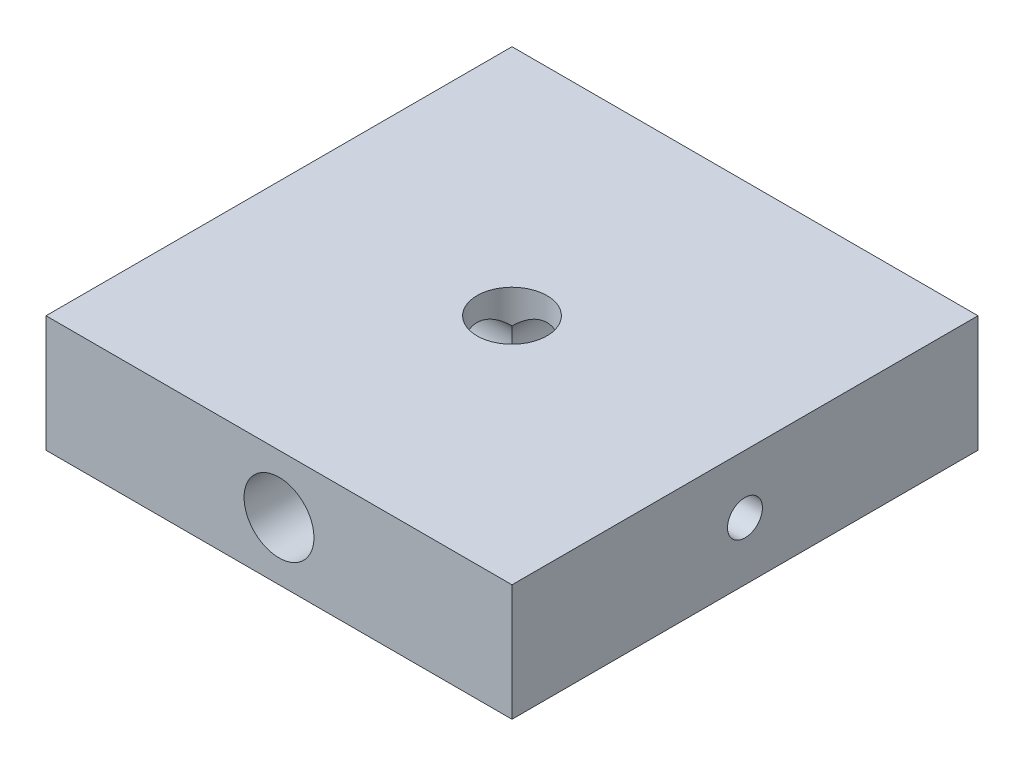
ISO-10303-21;
HEADER;
FILE_DESCRIPTION(('STEP AP214'),'2;1');
FILE_NAME('part.step','',(''),(''),'','','');
FILE_SCHEMA(('AUTOMOTIVE_DESIGN { 1 0 10303 214 1 1 1 1 }'));
ENDSEC;
DATA;
#1=APPLICATION_CONTEXT('core data for automotive mechanical design processes');
#2=APPLICATION_PROTOCOL_DEFINITION('international standard','automotive_design',2000,#1);
#3=PRODUCT_CONTEXT('',#1,'mechanical');
#4=PRODUCT('Part','Part','',(#3));
#5=PRODUCT_RELATED_PRODUCT_CATEGORY('part','',(#4));
#6=PRODUCT_DEFINITION_FORMATION('','',#4);
#7=PRODUCT_DEFINITION_CONTEXT('part definition',#1,'design');
#8=PRODUCT_DEFINITION('design','',#6,#7);
#9=PRODUCT_DEFINITION_SHAPE('','',#8);
#10=(LENGTH_UNIT() NAMED_UNIT(*) SI_UNIT(.MILLI.,.METRE.));
#11=(NAMED_UNIT(*) PLANE_ANGLE_UNIT() SI_UNIT($,.RADIAN.));
#12=(NAMED_UNIT(*) SI_UNIT($,.STERADIAN.) SOLID_ANGLE_UNIT());
#13=UNCERTAINTY_MEASURE_WITH_UNIT(LENGTH_MEASURE(1.E-05),#10,'distance_accuracy_value','');
#14=(GEOMETRIC_REPRESENTATION_CONTEXT(3) GLOBAL_UNCERTAINTY_ASSIGNED_CONTEXT((#13)) GLOBAL_UNIT_ASSIGNED_CONTEXT((#10,
#11,#12)) REPRESENTATION_CONTEXT('',''));
#15=CARTESIAN_POINT('',(0.,0.,0.));
#16=DIRECTION('',(0.,0.,1.));
#17=DIRECTION('',(1.,0.,0.));
#18=AXIS2_PLACEMENT_3D('',#15,#16,#17);
#19=CARTESIAN_POINT('',(0.,0.,-20.));
#20=DIRECTION('',(0.,0.,1.));
#21=DIRECTION('',(1.,0.,0.));
#22=AXIS2_PLACEMENT_3D('',#19,#20,#21);
#23=CYLINDRICAL_SURFACE('',#22,1.5);
#24=CARTESIAN_POINT('',(1.29903810567666,0.750000000000001,-10.7497495870781));
#25=CARTESIAN_POINT('',(1.27511464432901,0.791416541643271,-10.7911897819324));
#26=CARTESIAN_POINT('',(1.24892947696519,0.83221208637339,-10.8320057918435));
#27=CARTESIAN_POINT('',(1.19174112497098,0.912244017879416,-10.9120741352069));
#28=CARTESIAN_POINT('',(1.16072240849882,0.951474847611314,-10.9513208965639));
#29=CARTESIAN_POINT('',(1.09330759971749,1.02825974345045,-11.0281350449026));
#30=CARTESIAN_POINT('',(1.05684908459245,1.06578668998977,-11.0656752771585));
#31=CARTESIAN_POINT('',(0.978721037612754,1.13794974653868,-11.1378629272671));
#32=CARTESIAN_POINT('',(0.937059378139727,1.17259009469766,-11.1725145861965));
#33=CARTESIAN_POINT('',(0.840350526851361,1.24420790184499,-11.2441556349555));
#34=CARTESIAN_POINT('',(0.784244034258449,1.28048208259828,-11.2804414911451));
#35=CARTESIAN_POINT('',(0.664909112667032,1.34629452319567,-11.3462761006879));
#36=CARTESIAN_POINT('',(0.601713891644421,1.37586237954829,-11.3758544556352));
#37=CARTESIAN_POINT('',(0.47871407541481,1.42284925435497,-11.4228601503171));
#38=CARTESIAN_POINT('',(0.419795560130148,1.44141945673511,-11.4414387660361));
#39=CARTESIAN_POINT('',(0.298341366459725,1.47135917461159,-11.4713950346965));
#40=CARTESIAN_POINT('',(0.235805423714575,1.48272816312026,-11.4827721606299));
#41=CARTESIAN_POINT('',(0.1085852142336,1.49743880028038,-11.4974989852144));
#42=CARTESIAN_POINT('',(0.0438933506576993,1.50074813737528,-11.5008163718287));
#43=CARTESIAN_POINT('',(-0.0852563863436678,1.4989666989663,-11.4990510465123));
#44=CARTESIAN_POINT('',(-0.149714271058643,1.49387633429685,-11.4939687454154));
#45=CARTESIAN_POINT('',(-0.271814521270318,1.47636489272062,-11.4764730048235));
#46=CARTESIAN_POINT('',(-0.329616478597476,1.4644877977301,-11.4646035370458));
#47=CARTESIAN_POINT('',(-0.441894507301003,1.43461047531033,-11.4347417310686));
#48=CARTESIAN_POINT('',(-0.496371626534824,1.41661218891484,-11.416751333819));
#49=CARTESIAN_POINT('',(-0.619189034508718,1.36832873390818,-11.3684868803142));
#50=CARTESIAN_POINT('',(-0.685879203893564,1.33594663542933,-11.3361160719738));
#51=CARTESIAN_POINT('',(-0.811180359079277,1.26382507841526,-11.2640185161302));
#52=CARTESIAN_POINT('',(-0.869746288705667,1.2240472457019,-11.2242534017161));
#53=CARTESIAN_POINT('',(-0.964550081847773,1.14990785831052,-11.1501381988681));
#54=CARTESIAN_POINT('',(-1.00268253872559,1.11673347628072,-11.1169747817678));
#55=CARTESIAN_POINT('',(-1.07437319503784,1.04794651858372,-11.0482116227798));
#56=CARTESIAN_POINT('',(-1.1079262853143,1.01233128513655,-11.0126092251669));
#57=CARTESIAN_POINT('',(-1.17014312203526,0.939693336919766,-10.9399994278676));
#58=CARTESIAN_POINT('',(-1.19886647247207,0.902695943563578,-10.9030173139888));
#59=CARTESIAN_POINT('',(-1.25206439845904,0.82731501508056,-10.8276710635884));
#60=CARTESIAN_POINT('',(-1.27654954972619,0.788935227609418,-10.7893106641929));
#61=CARTESIAN_POINT('',(-1.29903810567665,0.750000000000001,-10.7503976721348));
#62=B_SPLINE_CURVE_WITH_KNOTS('',3,(#24,#25,#26,#27,#28,#29,#30,#31,#32,#33,#34,#35,#36,#37,#38,
#39,#40,#41,#42,#43,#44,#45,#46,#47,#48,#49,#50,#51,#52,#53,#54,#55,#56,#57,#58,#59,#60,#61),
.UNSPECIFIED.,.F.,.F.,(4,2,2,2,2,2,2,2,2,2,2,2,2,2,2,2,2,2,4),(0.,0.189866612214772,
0.380356414187857,0.573229503423911,0.765814231950156,0.993094810092584,1.21935193710475,
1.41206892665803,1.60480001768761,1.7983025148502,1.99179554797114,2.17160246063505,
2.35135240948963,2.59272605399861,2.83538895290785,3.01647128126453,3.1977540182231,
3.37660249600969,3.55499804380087),.UNSPECIFIED.);
#63=CARTESIAN_POINT('',(1.29903810567666,0.750000000000001,-10.7497495870781));
#64=VERTEX_POINT('',#63);
#65=CARTESIAN_POINT('',(-1.05988828872471,1.06143149351439,-11.0616919975508));
#66=VERTEX_POINT('',#65);
#67=EDGE_CURVE('E117',#64,#66,#62,.T.);
#68=ORIENTED_EDGE('',*,*,#67,.T.);
#69=CARTESIAN_POINT('',(-0.749999999999994,1.29903810567666,-10.7524438843595));
#70=CARTESIAN_POINT('',(-0.791474966642295,1.27508053973886,-10.7938080862093));
#71=CARTESIAN_POINT('',(-0.832318672463505,1.2488604404016,-10.8345559351006));
#72=CARTESIAN_POINT('',(-0.91243116283438,1.19160019255444,-10.9144978441075));
#73=CARTESIAN_POINT('',(-0.951694323621616,1.16054446945038,-10.9536863510264));
#74=CARTESIAN_POINT('',(-1.02853233850996,1.09305325311193,-11.0303872731834));
#75=CARTESIAN_POINT('',(-1.06607991531406,1.05655529868409,-11.0678725756803));
#76=CARTESIAN_POINT('',(-1.13827321461837,0.978346979708515,-11.1399505828077));
#77=CARTESIAN_POINT('',(-1.17292320244971,0.936644510232895,-11.1745475390345));
#78=CARTESIAN_POINT('',(-1.24452438327382,0.83988157681135,-11.2460397774227));
#79=CARTESIAN_POINT('',(-1.28077366592311,0.783766786138214,-11.2822343387924));
#80=CARTESIAN_POINT('',(-1.34653174904933,0.664427412338442,-11.3478885049052));
#81=CARTESIAN_POINT('',(-1.37607018618365,0.601236005354433,-11.3773777225186));
#82=CARTESIAN_POINT('',(-1.42300817611768,0.478241322560289,-11.424227460856));
#83=CARTESIAN_POINT('',(-1.44155728097269,0.419320779946205,-11.4427371040069));
#84=CARTESIAN_POINT('',(-1.47145372715688,0.297872964479321,-11.472555916));
#85=CARTESIAN_POINT('',(-1.48280052765151,0.235345421154571,-11.4838645441046));
#86=CARTESIAN_POINT('',(-1.49746917484998,0.108155002704537,-11.4984572538936));
#87=CARTESIAN_POINT('',(-1.50075889016487,0.0434846169310038,-11.5017092064161));
#88=CARTESIAN_POINT('',(-1.49894530814072,-0.0856120753272672,-11.4998200299267));
#89=CARTESIAN_POINT('',(-1.49384240136821,-0.150038393030327,-11.4946792914847));
#90=CARTESIAN_POINT('',(-1.47631292085969,-0.272095006037706,-11.4770761302946));
#91=CARTESIAN_POINT('',(-1.46442693337265,-0.329884516347488,-11.4651543415955));
#92=CARTESIAN_POINT('',(-1.43453658252856,-0.442132667133472,-11.4351911552631));
#93=CARTESIAN_POINT('',(-1.41653415156945,-0.496592353213105,-11.4171516904206));
#94=CARTESIAN_POINT('',(-1.36823250532858,-0.619403864143875,-11.3687608133281));
#95=CARTESIAN_POINT('',(-1.33583349634971,-0.686100385200389,-11.3363087691988));
#96=CARTESIAN_POINT('',(-1.2636823292925,-0.811403461770784,-11.2640448427042));
#97=CARTESIAN_POINT('',(-1.22389180993195,-0.869964890677812,-11.2241945648321));
#98=CARTESIAN_POINT('',(-1.14974132117162,-0.964748165372767,-11.1499304277903));
#99=CARTESIAN_POINT('',(-1.11656712359448,-1.00286711468167,-11.1167047018603));
#100=CARTESIAN_POINT('',(-1.04778743187299,-1.07452773454887,-11.0478131534385));
#101=CARTESIAN_POINT('',(-1.01217928949228,-1.10806429639944,-11.0121446730413));
#102=CARTESIAN_POINT('',(-0.939564660497332,-1.17024558279176,-10.9393976894386));
#103=CARTESIAN_POINT('',(-0.902583383353352,-1.19894996817376,-10.9023445634704));
#104=CARTESIAN_POINT('',(-0.827247821428806,-1.25210777351173,-10.8268458900234));
#105=CARTESIAN_POINT('',(-0.78889724818272,-1.27657176760186,-10.78840410367));
#106=CARTESIAN_POINT('',(-0.749999999999994,-1.29903810567666,-10.7494022184032));
#107=B_SPLINE_CURVE_WITH_KNOTS('',3,(#69,#70,#71,#72,#73,#74,#75,#76,#77,#78,#79,#80,#81,#82,
#83,#84,#85,#86,#87,#88,#89,#90,#91,#92,#93,#94,#95,#96,#97,#98,#99,#100,#101,#102,#103,#104,
#105,#106),.UNSPECIFIED.,.F.,.F.,(4,2,2,2,2,2,2,2,2,2,2,2,2,2,2,2,2,2,4),(0.,0.189871056870257,
0.380366807549209,0.573246508240148,0.765837094639792,0.992970045215826,1.21907953289419,
1.41172434354104,1.60438361853747,1.7978099702851,1.99122732082684,2.17103508217803,
2.3507860887256,2.59229251206705,2.83508924639655,3.01624836557675,3.19760783154663,
3.37653108167756,3.55500152849266),.UNSPECIFIED.);
#108=CARTESIAN_POINT('',(-0.749999999999994,-1.29903810567666,-10.7494022184032));
#109=VERTEX_POINT('',#108);
#110=EDGE_CURVE('E60',#66,#109,#107,.T.);
#111=ORIENTED_EDGE('',*,*,#110,.T.);
#112=DIRECTION('',(0.,0.,1.));
#113=VECTOR('',#112,1.);
#114=CARTESIAN_POINT('',(-0.749999999999994,-1.29903810567666,-20.));
#115=LINE('',#114,#113);
#116=CARTESIAN_POINT('',(-0.749999999999994,-1.29903810567666,-9.25244799624026));
#117=VERTEX_POINT('',#116);
#118=EDGE_CURVE('E11',#117,#109,#115,.F.);
#119=ORIENTED_EDGE('',*,*,#118,.F.);
#120=CARTESIAN_POINT('',(-0.749999999999994,-1.29903810567666,-9.25244799624026));
#121=CARTESIAN_POINT('',(-0.791378459668392,-1.27513687474722,-9.21095836403504));
#122=CARTESIAN_POINT('',(-0.832142627772044,-1.24897446133104,-9.17009802132006));
#123=CARTESIAN_POINT('',(-0.912122093315857,-1.1918329190911,-9.0899474616306));
#124=CARTESIAN_POINT('',(-0.951331877145022,-1.16083828631388,-9.05066282895527));
#125=CARTESIAN_POINT('',(-1.02808219851903,-1.09347319315618,-8.97377508772186));
#126=CARTESIAN_POINT('',(-1.06559571935928,-1.05704033513621,-8.93619916116777));
#127=CARTESIAN_POINT('',(-1.13773909535913,-0.978964502377515,-8.86394027364597));
#128=CARTESIAN_POINT('',(-1.17237317100989,-0.937329385246596,-8.82925307844539));
#129=CARTESIAN_POINT('',(-1.24400181635121,-0.840655694162198,-8.75751526360986));
#130=CARTESIAN_POINT('',(-1.2802922226279,-0.78455457602408,-8.72117001205713));
#131=CARTESIAN_POINT('',(-1.34614007890024,-0.66522249147517,-8.65521802645996));
#132=CARTESIAN_POINT('',(-1.37572709934252,-0.602024753800345,-8.62558169804843));
#133=CARTESIAN_POINT('',(-1.42274579442569,-0.479021563702528,-8.57847462627444));
#134=CARTESIAN_POINT('',(-1.44132971922107,-0.420104375446722,-8.55985119911318));
#135=CARTESIAN_POINT('',(-1.47129758577594,-0.298646056045469,-8.52980562635012));
#136=CARTESIAN_POINT('',(-1.48268100952381,-0.236104664524258,-8.51838399885356));
#137=CARTESIAN_POINT('',(-1.49741897118375,-0.108865111697055,-8.50357004192335));
#138=CARTESIAN_POINT('',(-1.5007410804287,-0.0441592972698246,-8.50021014342859));
#139=CARTESIAN_POINT('',(-1.49898057370908,0.0850249037105786,-8.50189500758968));
#140=CARTESIAN_POINT('',(-1.49389838180932,0.149503301574241,-8.50693934618406));
#141=CARTESIAN_POINT('',(-1.47639869776037,0.271631920374528,-8.52436533505102));
#142=CARTESIAN_POINT('',(-1.4645273949448,0.329441974488925,-8.53620084389843));
#143=CARTESIAN_POINT('',(-1.43465856572751,0.441739433185851,-8.56599685762213));
#144=CARTESIAN_POINT('',(-1.41666298597381,0.496227887083055,-8.58395541624385));
#145=CARTESIAN_POINT('',(-1.36839138611873,0.619049116349264,-8.63213786944534));
#146=CARTESIAN_POINT('',(-1.33602030281199,0.685735136299976,-8.66445599530223));
#147=CARTESIAN_POINT('',(-1.26391806122445,0.811034987077905,-8.73644566656105));
#148=CARTESIAN_POINT('',(-1.22414852050326,0.869603807415817,-8.77615556037113));
#149=CARTESIAN_POINT('',(-1.15001633968922,0.964421021122321,-8.85017432830909));
#150=CARTESIAN_POINT('',(-1.11684176255778,1.00256236172513,-8.88329748670564));
#151=CARTESIAN_POINT('',(-1.04804994491361,1.07427270544125,-8.95197771445309));
#152=CARTESIAN_POINT('',(-1.01243004041933,1.10783659904371,-8.98753743815741));
#153=CARTESIAN_POINT('',(-0.939776844195164,1.17007661881957,-9.06005866446648));
#154=CARTESIAN_POINT('',(-0.902768946062069,1.19881231247391,-9.09699494015761));
#155=CARTESIAN_POINT('',(-0.827358544647731,1.25203629926282,-9.17224281691926));
#156=CARTESIAN_POINT('',(-0.788959812316156,1.27653516920402,-9.21055069634732));
#157=CARTESIAN_POINT('',(-0.749999999999993,1.29903810567666,-9.24940633028403));
#158=B_SPLINE_CURVE_WITH_KNOTS('',3,(#120,#121,#122,#123,#124,#125,#126,#127,#128,#129,#130,
#131,#132,#133,#134,#135,#136,#137,#138,#139,#140,#141,#142,#143,#144,#145,#146,#147,#148,#149,
#150,#151,#152,#153,#154,#155,#156,#157),.UNSPECIFIED.,.F.,.F.,(4,2,2,2,2,2,2,2,2,2,2,2,2,2,2,2,
2,2,4),(0.,0.189863784729165,0.38034977466764,0.573218607669685,0.765799571161449,
0.99317642325616,1.21952983021213,1.41229381576803,1.60507166739103,1.79862374019291,
1.99216604702884,2.17197252684019,2.35172190709203,2.59300940802914,2.83558547781771,
3.01661869717197,3.19785236667682,3.37665304487231,3.55500071145519),.UNSPECIFIED.);
#159=CARTESIAN_POINT('',(-1.06074080598181,1.06057953144734,-8.93930711003029));
#160=VERTEX_POINT('',#159);
#161=EDGE_CURVE('E110',#117,#160,#158,.T.);
#162=ORIENTED_EDGE('',*,*,#161,.T.);
#163=CARTESIAN_POINT('',(-1.29903810567665,0.750000000000001,-9.24974977375113));
#164=CARTESIAN_POINT('',(-1.27510264111983,0.791437104228356,-9.20833630422284));
#165=CARTESIAN_POINT('',(-1.24890518269438,0.832249595946499,-9.16754426326347));
#166=CARTESIAN_POINT('',(-1.19169153823548,0.912309870879977,-9.08752037690789));
#167=CARTESIAN_POINT('',(-1.16065980530911,0.951552073581364,-9.04829409697988));
#168=CARTESIAN_POINT('',(-1.09321812357867,1.02835565418707,-8.97151975402266));
#169=CARTESIAN_POINT('',(-1.05674573841735,1.06588985699928,-8.93399883096142));
#170=CARTESIAN_POINT('',(-0.978589462704573,1.13806355066492,-8.86184972089755));
#171=CARTESIAN_POINT('',(-0.936913452517174,1.17270728922177,-8.82721728911858));
#172=CARTESIAN_POINT('',(-0.840185586371386,1.24431924458941,-8.75562856505456));
#173=CARTESIAN_POINT('',(-0.78407618050792,1.28058466322624,-8.71937481622481));
#174=CARTESIAN_POINT('',(-0.664739705622199,1.34637797604103,-8.65360366271685));
#175=CARTESIAN_POINT('',(-0.601545833370044,1.37593548083517,-8.62405665250192));
#176=CARTESIAN_POINT('',(-0.478547829680332,1.42290515987274,-8.57710578766052));
#177=CARTESIAN_POINT('',(-0.419628599701637,1.44146794317561,-8.55855141585058));
#178=CARTESIAN_POINT('',(-0.298176644136465,1.47139244353506,-8.52864346300553));
#179=CARTESIAN_POINT('',(-0.235643652039413,1.48275362874109,-8.51729041380057));
#180=CARTESIAN_POINT('',(-0.108433911635989,1.4974494971014,-8.50261073023784));
#181=CARTESIAN_POINT('',(-0.0437495968460782,1.5007519320401,-8.49931634361739));
#182=CARTESIAN_POINT('',(0.0853814946782426,1.49895918491263,-8.5011252016541));
#183=CARTESIAN_POINT('',(0.149828282682497,1.49386440654341,-8.5062280426136));
#184=CARTESIAN_POINT('',(0.271913190647791,1.47634661626244,-8.52376153322059));
#185=CARTESIAN_POINT('',(0.329710770723505,1.46446639241853,-8.53564938460628));
#186=CARTESIAN_POINT('',(0.441978293429504,1.43458448439919,-8.56554680997593));
#187=CARTESIAN_POINT('',(0.496449283126491,1.41658473822127,-8.58355444587863));
#188=CARTESIAN_POINT('',(0.61926462044284,1.36829488123725,-8.63186330818693));
#189=CARTESIAN_POINT('',(0.685957027306486,1.33590683263892,-8.66426265045123));
#190=CARTESIAN_POINT('',(0.811258869835418,1.26377485107404,-8.73641864177184));
#191=CARTESIAN_POINT('',(0.869823224585033,1.22399254843743,-8.77621366777429));
#192=CARTESIAN_POINT('',(0.964619786315391,1.14984926021023,-8.85038115123195));
#193=CARTESIAN_POINT('',(1.00274747224772,1.11667495909897,-8.8835664222492));
#194=CARTESIAN_POINT('',(1.07442753386111,1.04789058514827,-8.95237460702129));
#195=CARTESIAN_POINT('',(1.10797480055526,1.01227785788365,-8.98800017725804));
#196=CARTESIAN_POINT('',(1.17017912296766,0.939648127213286,-9.06065807631026));
#197=CARTESIAN_POINT('',(1.19889580257018,0.902656405989629,-9.09766508728871));
#198=CARTESIAN_POINT('',(1.25207962734806,0.827291423483316,-9.17306477452055));
#199=CARTESIAN_POINT('',(1.27655734767113,0.78892189719696,-9.21145370523516));
#200=CARTESIAN_POINT('',(1.29903810567666,0.750000000000001,-9.25039785880778));
#201=B_SPLINE_CURVE_WITH_KNOTS('',3,(#163,#164,#165,#166,#167,#168,#169,#170,#171,#172,#173,
#174,#175,#176,#177,#178,#179,#180,#181,#182,#183,#184,#185,#186,#187,#188,#189,#190,#191,#192,
#193,#194,#195,#196,#197,#198,#199,#200),.UNSPECIFIED.,.F.,.F.,(4,2,2,2,2,2,2,2,2,2,2,2,2,2,2,2,
2,2,4),(0.,0.189868161758125,0.38036004350807,0.573235448371787,0.765822227303785,
0.993050837979506,1.21925599373608,1.41194759073009,1.60465341667596,1.79812912649467,
1.9915955352185,2.17140272097419,2.35115301637714,2.59257330664434,2.83528322251035,
3.0163923759386,3.1977019159475,3.37657650972762,3.55499821788487),.UNSPECIFIED.);
#202=CARTESIAN_POINT('',(1.29903810567666,0.750000000000001,-9.25039785880778));
#203=VERTEX_POINT('',#202);
#204=EDGE_CURVE('E157',#160,#203,#201,.T.);
#205=ORIENTED_EDGE('',*,*,#204,.T.);
#206=DIRECTION('',(0.,0.,1.));
#207=VECTOR('',#206,1.);
#208=CARTESIAN_POINT('',(1.29903810567666,0.750000000000001,-20.));
#209=LINE('',#208,#207);
#210=EDGE_CURVE('E176',#64,#203,#209,.T.);
#211=ORIENTED_EDGE('',*,*,#210,.F.);
#212=EDGE_LOOP('',(#68,#111,#119,#162,#205,#211));
#213=FACE_BOUND('',#212,.T.);
#214=CARTESIAN_POINT('',(0.,0.,0.));
#215=DIRECTION('',(0.,0.,1.));
#216=DIRECTION('',(1.,0.,0.));
#217=AXIS2_PLACEMENT_3D('',#214,#215,#216);
#218=CIRCLE('',#217,1.5);
#219=CARTESIAN_POINT('',(1.50000000000001,0.,0.));
#220=VERTEX_POINT('',#219);
#221=EDGE_CURVE('E224',#220,#220,#218,.T.);
#222=ORIENTED_EDGE('',*,*,#221,.T.);
#223=EDGE_LOOP('',(#222));
#224=FACE_BOUND('',#223,.T.);
#225=CARTESIAN_POINT('',(0.,0.,-20.));
#226=DIRECTION('',(0.,0.,1.));
#227=DIRECTION('',(1.,0.,0.));
#228=AXIS2_PLACEMENT_3D('',#225,#226,#227);
#229=CIRCLE('',#228,1.5);
#230=CARTESIAN_POINT('',(1.50000000000001,0.,-20.));
#231=VERTEX_POINT('',#230);
#232=EDGE_CURVE('E209',#231,#231,#229,.T.);
#233=ORIENTED_EDGE('',*,*,#232,.F.);
#234=EDGE_LOOP('',(#233));
#235=FACE_BOUND('',#234,.T.);
#236=ADVANCED_FACE('F44',(#213,#224,#235),#23,.F.);
#237=CARTESIAN_POINT('',(10.,-2.5,-20.));
#238=DIRECTION('',(1.,0.,0.));
#239=DIRECTION('',(0.,0.,-1.));
#240=AXIS2_PLACEMENT_3D('',#237,#238,#239);
#241=PLANE('',#240);
#242=CARTESIAN_POINT('',(10.,-0.00575293694534501,-9.99843688559378));
#243=DIRECTION('',(1.,0.,0.));
#244=DIRECTION('',(0.,0.,-1.));
#245=AXIS2_PLACEMENT_3D('',#242,#243,#244);
#246=CIRCLE('',#245,0.75);
#247=CARTESIAN_POINT('',(10.,-0.00575293694534501,-10.7484368855938));
#248=VERTEX_POINT('',#247);
#249=EDGE_CURVE('E250',#248,#248,#246,.T.);
#250=ORIENTED_EDGE('',*,*,#249,.F.);
#251=EDGE_LOOP('',(#250));
#252=FACE_BOUND('',#251,.T.);
#253=DIRECTION('',(0.,1.,0.));
#254=VECTOR('',#253,1.);
#255=CARTESIAN_POINT('',(10.,-2.5,0.));
#256=LINE('',#255,#254);
#257=CARTESIAN_POINT('',(10.,-2.5,0.));
#258=VERTEX_POINT('',#257);
#259=CARTESIAN_POINT('',(10.,2.5,0.));
#260=VERTEX_POINT('',#259);
#261=EDGE_CURVE('E205',#258,#260,#256,.T.);
#262=ORIENTED_EDGE('',*,*,#261,.F.);
#263=DIRECTION('',(0.,0.,1.));
#264=VECTOR('',#263,1.);
#265=CARTESIAN_POINT('',(10.,-2.5,-20.));
#266=LINE('',#265,#264);
#267=CARTESIAN_POINT('',(10.,-2.5,-20.));
#268=VERTEX_POINT('',#267);
#269=EDGE_CURVE('E179',#268,#258,#266,.T.);
#270=ORIENTED_EDGE('',*,*,#269,.F.);
#271=DIRECTION('',(0.,1.,0.));
#272=VECTOR('',#271,1.);
#273=CARTESIAN_POINT('',(10.,-2.5,-20.));
#274=LINE('',#273,#272);
#275=CARTESIAN_POINT('',(10.,2.5,-20.));
#276=VERTEX_POINT('',#275);
#277=EDGE_CURVE('E196',#268,#276,#274,.T.);
#278=ORIENTED_EDGE('',*,*,#277,.T.);
#279=DIRECTION('',(0.,0.,1.));
#280=VECTOR('',#279,1.);
#281=CARTESIAN_POINT('',(10.,2.5,-20.));
#282=LINE('',#281,#280);
#283=EDGE_CURVE('E180',#276,#260,#282,.T.);
#284=ORIENTED_EDGE('',*,*,#283,.T.);
#285=EDGE_LOOP('',(#262,#270,#278,#284));
#286=FACE_BOUND('',#285,.T.);
#287=ADVANCED_FACE('F46',(#252,#286),#241,.T.);
#288=CARTESIAN_POINT('',(-9.99999999999999,-2.5,-20.));
#289=DIRECTION('',(0.,-1.,0.));
#290=DIRECTION('',(0.,0.,-1.));
#291=AXIS2_PLACEMENT_3D('',#288,#289,#290);
#292=PLANE('',#291);
#293=DIRECTION('',(1.,0.,0.));
#294=VECTOR('',#293,1.);
#295=CARTESIAN_POINT('',(-9.99999999999999,-2.5,0.));
#296=LINE('',#295,#294);
#297=CARTESIAN_POINT('',(-9.99999999999999,-2.5,0.));
#298=VERTEX_POINT('',#297);
#299=EDGE_CURVE('E192',#298,#258,#296,.T.);
#300=ORIENTED_EDGE('',*,*,#299,.F.);
#301=DIRECTION('',(0.,0.,1.));
#302=VECTOR('',#301,1.);
#303=CARTESIAN_POINT('',(-9.99999999999999,-2.5,-20.));
#304=LINE('',#303,#302);
#305=CARTESIAN_POINT('',(-9.99999999999999,-2.5,-20.));
#306=VERTEX_POINT('',#305);
#307=EDGE_CURVE('E187',#306,#298,#304,.T.);
#308=ORIENTED_EDGE('',*,*,#307,.F.);
#309=DIRECTION('',(1.,0.,0.));
#310=VECTOR('',#309,1.);
#311=CARTESIAN_POINT('',(-9.99999999999999,-2.5,-20.));
#312=LINE('',#311,#310);
#313=EDGE_CURVE('E184',#306,#268,#312,.T.);
#314=ORIENTED_EDGE('',*,*,#313,.T.);
#315=ORIENTED_EDGE('',*,*,#269,.T.);
#316=EDGE_LOOP('',(#300,#308,#314,#315));
#317=FACE_BOUND('',#316,.T.);
#318=ADVANCED_FACE('F239',(#317),#292,.T.);
#319=CARTESIAN_POINT('',(-9.99999999999999,-2.5,-20.));
#320=DIRECTION('',(-1.,0.,0.));
#321=DIRECTION('',(0.,0.,1.));
#322=AXIS2_PLACEMENT_3D('',#319,#320,#321);
#323=PLANE('',#322);
#324=CARTESIAN_POINT('',(-9.99999999999999,0.000878050922341601,-10.0009251073217));
#325=DIRECTION('',(-1.,0.,0.));
#326=DIRECTION('',(0.,0.,1.));
#327=AXIS2_PLACEMENT_3D('',#324,#325,#326);
#328=CIRCLE('',#327,1.5);
#329=CARTESIAN_POINT('',(-9.99999999999999,0.000878050922341601,-8.50092510732174));
#330=VERTEX_POINT('',#329);
#331=EDGE_CURVE('E112',#330,#330,#328,.T.);
#332=ORIENTED_EDGE('',*,*,#331,.F.);
#333=EDGE_LOOP('',(#332));
#334=FACE_BOUND('',#333,.T.);
#335=DIRECTION('',(0.,-1.,0.));
#336=VECTOR('',#335,1.);
#337=CARTESIAN_POINT('',(-9.99999999999999,-2.5,0.));
#338=LINE('',#337,#336);
#339=CARTESIAN_POINT('',(-9.99999999999999,2.5,0.));
#340=VERTEX_POINT('',#339);
#341=EDGE_CURVE('E197',#340,#298,#338,.T.);
#342=ORIENTED_EDGE('',*,*,#341,.F.);
#343=DIRECTION('',(0.,0.,1.));
#344=VECTOR('',#343,1.);
#345=CARTESIAN_POINT('',(-9.99999999999999,2.5,-20.));
#346=LINE('',#345,#344);
#347=CARTESIAN_POINT('',(-9.99999999999999,2.5,-20.));
#348=VERTEX_POINT('',#347);
#349=EDGE_CURVE('E183',#348,#340,#346,.T.);
#350=ORIENTED_EDGE('',*,*,#349,.F.);
#351=DIRECTION('',(0.,-1.,0.));
#352=VECTOR('',#351,1.);
#353=CARTESIAN_POINT('',(-9.99999999999999,-2.5,-20.));
#354=LINE('',#353,#352);
#355=EDGE_CURVE('E213',#348,#306,#354,.T.);
#356=ORIENTED_EDGE('',*,*,#355,.T.);
#357=ORIENTED_EDGE('',*,*,#307,.T.);
#358=EDGE_LOOP('',(#342,#350,#356,#357));
#359=FACE_BOUND('',#358,.T.);
#360=ADVANCED_FACE('F244',(#334,#359),#323,.T.);
#361=CARTESIAN_POINT('',(-9.99999999999999,2.5,-20.));
#362=DIRECTION('',(0.,1.,0.));
#363=DIRECTION('',(0.,0.,1.));
#364=AXIS2_PLACEMENT_3D('',#361,#362,#363);
#365=PLANE('',#364);
#366=CARTESIAN_POINT('',(-0.000187086017669296,2.5,-10.000073722943));
#367=DIRECTION('',(0.,1.,0.));
#368=DIRECTION('',(0.,0.,1.));
#369=AXIS2_PLACEMENT_3D('',#366,#367,#368);
#370=CIRCLE('',#369,1.5);
#371=CARTESIAN_POINT('',(-0.000187086017669296,2.5,-8.50007372294296));
#372=VERTEX_POINT('',#371);
#373=EDGE_CURVE('E119',#372,#372,#370,.T.);
#374=ORIENTED_EDGE('',*,*,#373,.F.);
#375=EDGE_LOOP('',(#374));
#376=FACE_BOUND('',#375,.T.);
#377=DIRECTION('',(-1.,0.,0.));
#378=VECTOR('',#377,1.);
#379=CARTESIAN_POINT('',(-9.99999999999999,2.5,0.));
#380=LINE('',#379,#378);
#381=EDGE_CURVE('E201',#260,#340,#380,.T.);
#382=ORIENTED_EDGE('',*,*,#381,.F.);
#383=ORIENTED_EDGE('',*,*,#283,.F.);
#384=DIRECTION('',(-1.,0.,0.));
#385=VECTOR('',#384,1.);
#386=CARTESIAN_POINT('',(-9.99999999999999,2.5,-20.));
#387=LINE('',#386,#385);
#388=EDGE_CURVE('E217',#276,#348,#387,.T.);
#389=ORIENTED_EDGE('',*,*,#388,.T.);
#390=ORIENTED_EDGE('',*,*,#349,.T.);
#391=EDGE_LOOP('',(#382,#383,#389,#390));
#392=FACE_BOUND('',#391,.T.);
#393=ADVANCED_FACE('F261',(#376,#392),#365,.T.);
#394=CARTESIAN_POINT('',(0.,0.,-20.));
#395=DIRECTION('',(0.,0.,-1.));
#396=DIRECTION('',(-1.,0.,0.));
#397=AXIS2_PLACEMENT_3D('',#394,#395,#396);
#398=PLANE('',#397);
#399=ORIENTED_EDGE('',*,*,#232,.T.);
#400=EDGE_LOOP('',(#399));
#401=FACE_BOUND('',#400,.T.);
#402=ORIENTED_EDGE('',*,*,#277,.F.);
#403=ORIENTED_EDGE('',*,*,#313,.F.);
#404=ORIENTED_EDGE('',*,*,#355,.F.);
#405=ORIENTED_EDGE('',*,*,#388,.F.);
#406=EDGE_LOOP('',(#402,#403,#404,#405));
#407=FACE_BOUND('',#406,.T.);
#408=ADVANCED_FACE('F232',(#401,#407),#398,.T.);
#409=CARTESIAN_POINT('',(0.,0.,0.));
#410=DIRECTION('',(0.,0.,-1.));
#411=DIRECTION('',(-1.,0.,0.));
#412=AXIS2_PLACEMENT_3D('',#409,#410,#411);
#413=PLANE('',#412);
#414=ORIENTED_EDGE('',*,*,#221,.F.);
#415=EDGE_LOOP('',(#414));
#416=FACE_BOUND('',#415,.T.);
#417=ORIENTED_EDGE('',*,*,#261,.T.);
#418=ORIENTED_EDGE('',*,*,#381,.T.);
#419=ORIENTED_EDGE('',*,*,#341,.T.);
#420=ORIENTED_EDGE('',*,*,#299,.T.);
#421=EDGE_LOOP('',(#417,#418,#419,#420));
#422=FACE_BOUND('',#421,.T.);
#423=ADVANCED_FACE('F166',(#416,#422),#413,.F.);
#424=CARTESIAN_POINT('',(-0.000187086017669296,0.750000000000001,-10.000073722943));
#425=DIRECTION('',(0.,1.,0.));
#426=DIRECTION('',(0.,0.,1.));
#427=AXIS2_PLACEMENT_3D('',#424,#425,#426);
#428=CYLINDRICAL_SURFACE('',#427,1.5);
#429=ORIENTED_EDGE('',*,*,#373,.T.);
#430=EDGE_LOOP('',(#429));
#431=FACE_BOUND('',#430,.T.);
#432=ORIENTED_EDGE('',*,*,#204,.F.);
#433=CARTESIAN_POINT('',(-0.750784044290828,0.750000000000001,-8.70138045421817));
#434=CARTESIAN_POINT('',(-0.792158375993628,0.79148196621649,-8.72530467997244));
#435=CARTESIAN_POINT('',(-0.832917347652438,0.832334065682011,-8.75149063873525));
#436=CARTESIAN_POINT('',(-0.912884091893057,0.912466504601325,-8.80868063111004));
#437=CARTESIAN_POINT('',(-0.952086333659194,0.951741244746668,-8.83970019748176));
#438=CARTESIAN_POINT('',(-1.02881859286179,1.02860662066556,-8.9071167665961));
#439=CARTESIAN_POINT('',(-1.06632155192345,1.0661700380799,-8.9435761929084));
#440=CARTESIAN_POINT('',(-1.13844002035729,1.13840042298538,-9.02170609926598));
#441=CARTESIAN_POINT('',(-1.17305976310173,1.17307163717043,-9.06336870642597));
#442=CARTESIAN_POINT('',(-1.24463439134274,1.24475202940632,-9.16007882888147));
#443=CARTESIAN_POINT('',(-1.28088649924745,1.28105726778305,-9.21618553163833));
#444=CARTESIAN_POINT('',(-1.34665685881842,1.34692851011503,-9.33552059753644));
#445=CARTESIAN_POINT('',(-1.37620469857904,1.37652412530574,-9.39871575342204));
#446=CARTESIAN_POINT('',(-1.4231557635845,1.4235608334178,-9.521715470927));
#447=CARTESIAN_POINT('',(-1.44170996923705,1.44215332562841,-9.58063402785668));
#448=CARTESIAN_POINT('',(-1.47161817716356,1.47213685127209,-9.70208806038034));
#449=CARTESIAN_POINT('',(-1.48297165208994,1.48352735726547,-9.76462380051388));
#450=CARTESIAN_POINT('',(-1.49765147988554,1.49828084941351,-9.8918433025994));
#451=CARTESIAN_POINT('',(-1.50094552590341,1.50161152653176,-9.95653465945774));
#452=CARTESIAN_POINT('',(-1.49913364589329,1.49987297274053,-10.085683138167));
#453=CARTESIAN_POINT('',(-1.49402813118627,1.4948041531488,-10.1501402713329));
#454=CARTESIAN_POINT('',(-1.47648734367318,1.47733481689968,-10.272239464767));
#455=CARTESIAN_POINT('',(-1.46459599304235,1.46547817600626,-10.3300411085174));
#456=CARTESIAN_POINT('',(-1.43468978167738,1.4356425765888,-10.4423184312456));
#457=CARTESIAN_POINT('',(-1.41667685806207,1.41766555480314,-10.4967951559404));
#458=CARTESIAN_POINT('',(-1.36835792133149,1.36943309068009,-10.6196125387493));
#459=CARTESIAN_POINT('',(-1.33595457174457,1.33708112100976,-10.6863029438163));
#460=CARTESIAN_POINT('',(-1.26378807283257,1.26502384837715,-10.8116041099306));
#461=CARTESIAN_POINT('',(-1.22398655915903,1.22528021412114,-10.8701698402339));
#462=CARTESIAN_POINT('',(-1.14983011636399,1.15123379162217,-10.9649376609064));
#463=CARTESIAN_POINT('',(-1.1166658303999,1.11811935998032,-11.0030385610726));
#464=CARTESIAN_POINT('',(-1.04789960816333,1.04946133406692,-11.0746738448471));
#465=CARTESIAN_POINT('',(-1.01229502209741,1.0139150993082,-11.1082031424544));
#466=CARTESIAN_POINT('',(-0.939675706219584,0.941423742380827,-11.170380440173));
#467=CARTESIAN_POINT('',(-0.90268630724428,0.90450378950996,-11.1990878994498));
#468=CARTESIAN_POINT('',(-0.827315445178385,0.829290511764769,-11.2522609834058));
#469=CARTESIAN_POINT('',(-0.788937734901575,0.791000892039503,-11.2767371409342));
#470=CARTESIAN_POINT('',(-0.749999999999994,0.752164165869967,-11.2992198248212));
#471=B_SPLINE_CURVE_WITH_KNOTS('',3,(#433,#434,#435,#436,#437,#438,#439,#440,#441,#442,#443,
#444,#445,#446,#447,#448,#449,#450,#451,#452,#453,#454,#455,#456,#457,#458,#459,#460,#461,#462,
#463,#464,#465,#466,#467,#468,#469,#470),.UNSPECIFIED.,.F.,.F.,(4,2,2,2,2,2,2,2,2,2,2,2,2,2,2,2,
2,2,4),(0.,0.189866747502011,0.380356715344435,0.573229977885601,0.765814863277401,
0.993092085454326,1.21934585616451,1.41206114406434,1.60479054389408,1.79829125797797,
1.9917824967409,2.17158937719484,2.35133941221438,2.59271655441231,2.83538220380691,
3.01630837238706,3.19743421066148,3.37612976513433,3.5543738845621),.UNSPECIFIED.);
#472=EDGE_CURVE('E53',#160,#66,#471,.T.);
#473=ORIENTED_EDGE('',*,*,#472,.T.);
#474=ORIENTED_EDGE('',*,*,#67,.F.);
#475=CARTESIAN_POINT('',(-0.000187086017669296,0.750000000000001,-10.000073722943));
#476=DIRECTION('',(0.,1.,0.));
#477=DIRECTION('',(0.,0.,1.));
#478=AXIS2_PLACEMENT_3D('',#475,#476,#477);
#479=CIRCLE('',#478,1.5);
#480=EDGE_CURVE('E67',#203,#64,#479,.T.);
#481=ORIENTED_EDGE('',*,*,#480,.F.);
#482=EDGE_LOOP('',(#432,#473,#474,#481));
#483=FACE_BOUND('',#482,.T.);
#484=ADVANCED_FACE('F163',(#431,#483),#428,.F.);
#485=CARTESIAN_POINT('',(-0.000187086017669296,0.750000000000001,-10.000073722943));
#486=DIRECTION('',(0.,1.,0.));
#487=DIRECTION('',(0.,0.,1.));
#488=AXIS2_PLACEMENT_3D('',#485,#486,#487);
#489=PLANE('',#488);
#490=ORIENTED_EDGE('',*,*,#210,.T.);
#491=ORIENTED_EDGE('',*,*,#480,.T.);
#492=EDGE_LOOP('',(#490,#491));
#493=FACE_BOUND('',#492,.T.);
#494=ADVANCED_FACE('F148',(#493),#489,.T.);
#495=CARTESIAN_POINT('',(-0.749999999999994,0.000878050922341601,-10.0009251073217));
#496=DIRECTION('',(-1.,0.,0.));
#497=DIRECTION('',(0.,0.,1.));
#498=AXIS2_PLACEMENT_3D('',#495,#496,#497);
#499=PLANE('',#498);
#500=ORIENTED_EDGE('',*,*,#118,.T.);
#501=CARTESIAN_POINT('',(-0.749999999999994,0.000878050922341601,-10.0009251073217));
#502=DIRECTION('',(-1.,0.,0.));
#503=DIRECTION('',(0.,0.,1.));
#504=AXIS2_PLACEMENT_3D('',#501,#502,#503);
#505=CIRCLE('',#504,1.5);
#506=EDGE_CURVE('E106',#109,#117,#505,.T.);
#507=ORIENTED_EDGE('',*,*,#506,.T.);
#508=EDGE_LOOP('',(#500,#507));
#509=FACE_BOUND('',#508,.T.);
#510=ADVANCED_FACE('F105',(#509),#499,.T.);
#511=CARTESIAN_POINT('',(-0.749999999999994,0.000878050922341601,-10.0009251073217));
#512=DIRECTION('',(-1.,0.,0.));
#513=DIRECTION('',(0.,0.,1.));
#514=AXIS2_PLACEMENT_3D('',#511,#512,#513);
#515=CYLINDRICAL_SURFACE('',#514,1.5);
#516=ORIENTED_EDGE('',*,*,#331,.T.);
#517=EDGE_LOOP('',(#516));
#518=FACE_BOUND('',#517,.T.);
#519=ORIENTED_EDGE('',*,*,#472,.F.);
#520=ORIENTED_EDGE('',*,*,#161,.F.);
#521=ORIENTED_EDGE('',*,*,#506,.F.);
#522=ORIENTED_EDGE('',*,*,#110,.F.);
#523=EDGE_LOOP('',(#519,#520,#521,#522));
#524=FACE_BOUND('',#523,.T.);
#525=ADVANCED_FACE('F109',(#518,#524),#515,.F.);
#526=CARTESIAN_POINT('',(2.00000000000001,-0.00575293694534501,-9.99843688559378));
#527=DIRECTION('',(1.,0.,0.));
#528=DIRECTION('',(0.,0.,-1.));
#529=AXIS2_PLACEMENT_3D('',#526,#527,#528);
#530=CYLINDRICAL_SURFACE('',#529,0.75);
#531=CARTESIAN_POINT('',(2.00000000000001,-0.00575293694534501,-9.99843688559378));
#532=DIRECTION('',(1.,0.,0.));
#533=DIRECTION('',(0.,0.,-1.));
#534=AXIS2_PLACEMENT_3D('',#531,#532,#533);
#535=CIRCLE('',#534,0.75);
#536=CARTESIAN_POINT('',(2.00000000000001,-0.00575293694534501,-10.7484368855938));
#537=VERTEX_POINT('',#536);
#538=EDGE_CURVE('E383',#537,#537,#535,.T.);
#539=ORIENTED_EDGE('',*,*,#538,.F.);
#540=EDGE_LOOP('',(#539));
#541=FACE_BOUND('',#540,.T.);
#542=ORIENTED_EDGE('',*,*,#249,.T.);
#543=EDGE_LOOP('',(#542));
#544=FACE_BOUND('',#543,.T.);
#545=ADVANCED_FACE('F145',(#541,#544),#530,.F.);
#546=CARTESIAN_POINT('',(2.00000000000001,-0.00575293694534501,-9.99843688559378));
#547=DIRECTION('',(1.,0.,0.));
#548=DIRECTION('',(0.,0.,-1.));
#549=AXIS2_PLACEMENT_3D('',#546,#547,#548);
#550=PLANE('',#549);
#551=ORIENTED_EDGE('',*,*,#538,.T.);
#552=EDGE_LOOP('',(#551));
#553=FACE_BOUND('',#552,.T.);
#554=ADVANCED_FACE('F308',(#553),#550,.T.);
#555=CLOSED_SHELL('',(#236,#287,#318,#360,#393,#408,#423,#484,#494,#510,#525,#545,#554));
#556=MANIFOLD_SOLID_BREP('B2',#555);
#557=ADVANCED_BREP_SHAPE_REPRESENTATION('',(#18,#556),#14);
#558=SHAPE_DEFINITION_REPRESENTATION(#9,#557);
ENDSEC;
END-ISO-10303-21;
